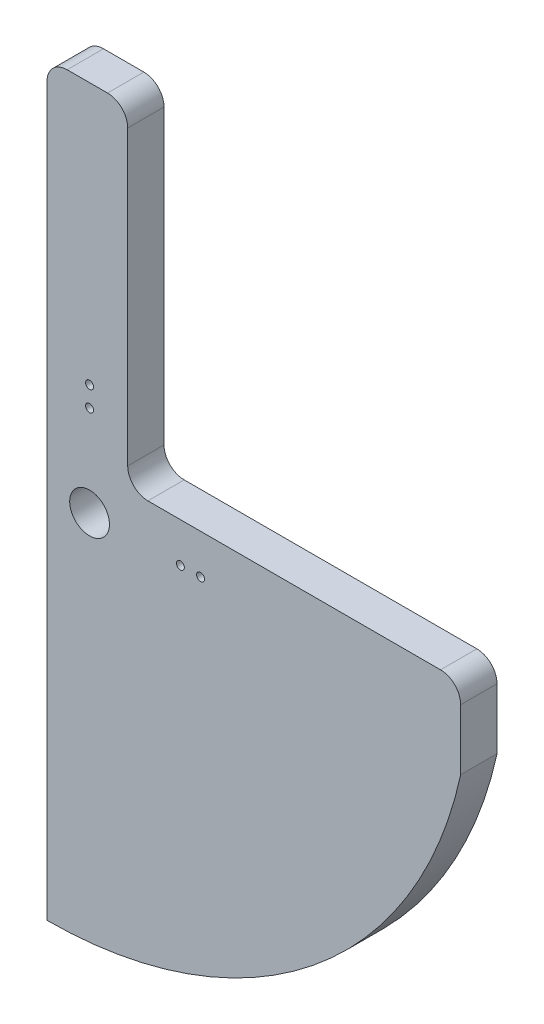
ISO-10303-21;
HEADER;
FILE_DESCRIPTION(('STEP AP214'),'2;1');
FILE_NAME('part.step','',(''),(''),'','','');
FILE_SCHEMA(('AUTOMOTIVE_DESIGN { 1 0 10303 214 1 1 1 1 }'));
ENDSEC;
DATA;
#1=APPLICATION_CONTEXT('core data for automotive mechanical design processes');
#2=APPLICATION_PROTOCOL_DEFINITION('international standard','automotive_design',2000,#1);
#3=PRODUCT_CONTEXT('',#1,'mechanical');
#4=PRODUCT('Part','Part','',(#3));
#5=PRODUCT_RELATED_PRODUCT_CATEGORY('part','',(#4));
#6=PRODUCT_DEFINITION_FORMATION('','',#4);
#7=PRODUCT_DEFINITION_CONTEXT('part definition',#1,'design');
#8=PRODUCT_DEFINITION('design','',#6,#7);
#9=PRODUCT_DEFINITION_SHAPE('','',#8);
#10=(LENGTH_UNIT() NAMED_UNIT(*) SI_UNIT(.MILLI.,.METRE.));
#11=(NAMED_UNIT(*) PLANE_ANGLE_UNIT() SI_UNIT($,.RADIAN.));
#12=(NAMED_UNIT(*) SI_UNIT($,.STERADIAN.) SOLID_ANGLE_UNIT());
#13=UNCERTAINTY_MEASURE_WITH_UNIT(LENGTH_MEASURE(1.E-05),#10,'distance_accuracy_value','');
#14=(GEOMETRIC_REPRESENTATION_CONTEXT(3) GLOBAL_UNCERTAINTY_ASSIGNED_CONTEXT((#13)) GLOBAL_UNIT_ASSIGNED_CONTEXT((#10,
#11,#12)) REPRESENTATION_CONTEXT('',''));
#15=CARTESIAN_POINT('',(0.,0.,0.));
#16=DIRECTION('',(0.,0.,1.));
#17=DIRECTION('',(1.,0.,0.));
#18=AXIS2_PLACEMENT_3D('',#15,#16,#17);
#19=CARTESIAN_POINT('',(-5.35982545721608,6.22164166704507,4.572));
#20=DIRECTION('',(0.,0.,1.));
#21=DIRECTION('',(1.,0.,0.));
#22=AXIS2_PLACEMENT_3D('',#19,#20,#21);
#23=PLANE('',#22);
#24=CARTESIAN_POINT('',(0.,13.97,4.572));
#25=DIRECTION('',(0.,0.,1.));
#26=DIRECTION('',(1.,0.,0.));
#27=AXIS2_PLACEMENT_3D('',#24,#25,#26);
#28=CIRCLE('',#27,0.5);
#29=CARTESIAN_POINT('',(0.5,13.97,4.572));
#30=VERTEX_POINT('',#29);
#31=EDGE_CURVE('E223',#30,#30,#28,.T.);
#32=ORIENTED_EDGE('',*,*,#31,.F.);
#33=EDGE_LOOP('',(#32));
#34=FACE_BOUND('',#33,.T.);
#35=CARTESIAN_POINT('',(0.,11.43,4.572));
#36=DIRECTION('',(0.,0.,1.));
#37=DIRECTION('',(1.,0.,0.));
#38=AXIS2_PLACEMENT_3D('',#35,#36,#37);
#39=CIRCLE('',#38,0.5);
#40=CARTESIAN_POINT('',(0.5,11.43,4.572));
#41=VERTEX_POINT('',#40);
#42=EDGE_CURVE('E211',#41,#41,#39,.T.);
#43=ORIENTED_EDGE('',*,*,#42,.F.);
#44=EDGE_LOOP('',(#43));
#45=FACE_BOUND('',#44,.T.);
#46=CARTESIAN_POINT('',(-5.35982545721608,6.22164166704507,4.572));
#47=DIRECTION('',(0.,0.,1.));
#48=DIRECTION('',(1.,0.,0.));
#49=AXIS2_PLACEMENT_3D('',#46,#47,#48);
#50=CIRCLE('',#49,53.3015151515152);
#51=CARTESIAN_POINT('',(-5.35982545721608,-47.0798734844701,4.572));
#52=VERTEX_POINT('',#51);
#53=CARTESIAN_POINT('',(46.7101745427839,-5.1698734844701,4.572));
#54=VERTEX_POINT('',#53);
#55=EDGE_CURVE('E162',#52,#54,#50,.T.);
#56=ORIENTED_EDGE('',*,*,#55,.T.);
#57=DIRECTION('',(0.,1.,0.));
#58=VECTOR('',#57,1.);
#59=CARTESIAN_POINT('',(46.7101745427839,-2.62987348447008,4.572));
#60=LINE('',#59,#58);
#61=CARTESIAN_POINT('',(46.7101745427839,2.45012651552991,4.572));
#62=VERTEX_POINT('',#61);
#63=EDGE_CURVE('E96',#54,#62,#60,.T.);
#64=ORIENTED_EDGE('',*,*,#63,.T.);
#65=CARTESIAN_POINT('',(44.1701745427839,2.45012651552991,4.572));
#66=DIRECTION('',(0.,0.,1.));
#67=DIRECTION('',(-1.,0.,0.));
#68=AXIS2_PLACEMENT_3D('',#65,#66,#67);
#69=CIRCLE('',#68,2.54);
#70=CARTESIAN_POINT('',(44.1701745427839,4.99012651552991,4.572));
#71=VERTEX_POINT('',#70);
#72=EDGE_CURVE('E183',#62,#71,#69,.T.);
#73=ORIENTED_EDGE('',*,*,#72,.T.);
#74=DIRECTION('',(-1.,0.,0.));
#75=VECTOR('',#74,1.);
#76=CARTESIAN_POINT('',(7.34017454278392,4.9901265155299,4.572));
#77=LINE('',#76,#75);
#78=CARTESIAN_POINT('',(7.34017454278391,4.9901265155299,4.572));
#79=VERTEX_POINT('',#78);
#80=EDGE_CURVE('E200',#71,#79,#77,.T.);
#81=ORIENTED_EDGE('',*,*,#80,.T.);
#82=CARTESIAN_POINT('',(7.34017454278391,7.5301265155299,4.572));
#83=DIRECTION('',(0.,0.,-1.));
#84=DIRECTION('',(1.,0.,0.));
#85=AXIS2_PLACEMENT_3D('',#82,#83,#84);
#86=CIRCLE('',#85,2.54);
#87=CARTESIAN_POINT('',(4.80017454278391,7.5301265155299,4.572));
#88=VERTEX_POINT('',#87);
#89=EDGE_CURVE('E197',#79,#88,#86,.T.);
#90=ORIENTED_EDGE('',*,*,#89,.T.);
#91=DIRECTION('',(0.,1.,0.));
#92=VECTOR('',#91,1.);
#93=CARTESIAN_POINT('',(4.80017454278391,7.5301265155299,4.572));
#94=LINE('',#93,#92);
#95=CARTESIAN_POINT('',(4.80017454278391,44.3601265155299,4.572));
#96=VERTEX_POINT('',#95);
#97=EDGE_CURVE('E199',#88,#96,#94,.T.);
#98=ORIENTED_EDGE('',*,*,#97,.T.);
#99=CARTESIAN_POINT('',(2.26017454278391,44.3601265155299,4.572));
#100=DIRECTION('',(0.,0.,1.));
#101=DIRECTION('',(-1.,0.,0.));
#102=AXIS2_PLACEMENT_3D('',#99,#100,#101);
#103=CIRCLE('',#102,2.54);
#104=CARTESIAN_POINT('',(2.26017454278391,46.9001265155299,4.572));
#105=VERTEX_POINT('',#104);
#106=EDGE_CURVE('E122',#96,#105,#103,.T.);
#107=ORIENTED_EDGE('',*,*,#106,.T.);
#108=DIRECTION('',(-1.,0.,0.));
#109=VECTOR('',#108,1.);
#110=CARTESIAN_POINT('',(-2.81982545721606,46.9001265155299,4.572));
#111=LINE('',#110,#109);
#112=CARTESIAN_POINT('',(-2.81982545721607,46.9001265155299,4.572));
#113=VERTEX_POINT('',#112);
#114=EDGE_CURVE('E115',#105,#113,#111,.T.);
#115=ORIENTED_EDGE('',*,*,#114,.T.);
#116=CARTESIAN_POINT('',(-2.81982545721608,44.3601265155299,4.572));
#117=DIRECTION('',(0.,0.,1.));
#118=DIRECTION('',(-1.,0.,0.));
#119=AXIS2_PLACEMENT_3D('',#116,#117,#118);
#120=CIRCLE('',#119,2.54);
#121=CARTESIAN_POINT('',(-5.35982545721608,44.3601265155299,4.572));
#122=VERTEX_POINT('',#121);
#123=EDGE_CURVE('E119',#113,#122,#120,.T.);
#124=ORIENTED_EDGE('',*,*,#123,.T.);
#125=DIRECTION('',(0.,-1.,0.));
#126=VECTOR('',#125,1.);
#127=CARTESIAN_POINT('',(-5.35982545721608,44.3601265155299,4.572));
#128=LINE('',#127,#126);
#129=EDGE_CURVE('E49',#122,#52,#128,.T.);
#130=ORIENTED_EDGE('',*,*,#129,.T.);
#131=EDGE_LOOP('',(#56,#64,#73,#81,#90,#98,#107,#115,#124,#130));
#132=FACE_BOUND('',#131,.T.);
#133=CARTESIAN_POINT('',(0.,0.,4.572));
#134=DIRECTION('',(0.,0.,1.));
#135=DIRECTION('',(1.,0.,0.));
#136=AXIS2_PLACEMENT_3D('',#133,#134,#135);
#137=CIRCLE('',#136,2.5);
#138=CARTESIAN_POINT('',(2.5,0.,4.572));
#139=VERTEX_POINT('',#138);
#140=EDGE_CURVE('E146',#139,#139,#137,.T.);
#141=ORIENTED_EDGE('',*,*,#140,.F.);
#142=EDGE_LOOP('',(#141));
#143=FACE_BOUND('',#142,.T.);
#144=CARTESIAN_POINT('',(11.43,0.,4.572));
#145=DIRECTION('',(0.,0.,1.));
#146=DIRECTION('',(1.,0.,0.));
#147=AXIS2_PLACEMENT_3D('',#144,#145,#146);
#148=CIRCLE('',#147,0.500000000000001);
#149=CARTESIAN_POINT('',(11.93,0.,4.572));
#150=VERTEX_POINT('',#149);
#151=EDGE_CURVE('E217',#150,#150,#148,.T.);
#152=ORIENTED_EDGE('',*,*,#151,.F.);
#153=EDGE_LOOP('',(#152));
#154=FACE_BOUND('',#153,.T.);
#155=CARTESIAN_POINT('',(13.97,0.,4.572));
#156=DIRECTION('',(0.,0.,1.));
#157=DIRECTION('',(1.,0.,0.));
#158=AXIS2_PLACEMENT_3D('',#155,#156,#157);
#159=CIRCLE('',#158,0.500000000000001);
#160=CARTESIAN_POINT('',(14.47,0.,4.572));
#161=VERTEX_POINT('',#160);
#162=EDGE_CURVE('E229',#161,#161,#159,.T.);
#163=ORIENTED_EDGE('',*,*,#162,.F.);
#164=EDGE_LOOP('',(#163));
#165=FACE_BOUND('',#164,.T.);
#166=ADVANCED_FACE('F32',(#34,#45,#132,#143,#154,#165),#23,.T.);
#167=CARTESIAN_POINT('',(-5.35982545721608,6.22164166704507,0.));
#168=DIRECTION('',(0.,0.,1.));
#169=DIRECTION('',(1.,0.,0.));
#170=AXIS2_PLACEMENT_3D('',#167,#168,#169);
#171=PLANE('',#170);
#172=CARTESIAN_POINT('',(-5.35982545721608,6.22164166704507,0.));
#173=DIRECTION('',(0.,0.,1.));
#174=DIRECTION('',(1.,0.,0.));
#175=AXIS2_PLACEMENT_3D('',#172,#173,#174);
#176=CIRCLE('',#175,53.3015151515152);
#177=CARTESIAN_POINT('',(-5.35982545721608,-47.0798734844701,0.));
#178=VERTEX_POINT('',#177);
#179=CARTESIAN_POINT('',(46.7101745427839,-5.1698734844701,0.));
#180=VERTEX_POINT('',#179);
#181=EDGE_CURVE('E142',#178,#180,#176,.T.);
#182=ORIENTED_EDGE('',*,*,#181,.F.);
#183=DIRECTION('',(0.,-1.,0.));
#184=VECTOR('',#183,1.);
#185=CARTESIAN_POINT('',(-5.35982545721608,-5.1698734844701,0.));
#186=LINE('',#185,#184);
#187=CARTESIAN_POINT('',(-5.35982545721608,44.3601265155299,0.));
#188=VERTEX_POINT('',#187);
#189=EDGE_CURVE('E84',#188,#178,#186,.T.);
#190=ORIENTED_EDGE('',*,*,#189,.F.);
#191=CARTESIAN_POINT('',(-2.81982545721608,44.3601265155299,0.));
#192=DIRECTION('',(0.,0.,1.));
#193=DIRECTION('',(-1.,0.,0.));
#194=AXIS2_PLACEMENT_3D('',#191,#192,#193);
#195=CIRCLE('',#194,2.54);
#196=CARTESIAN_POINT('',(-2.81982545721607,46.9001265155299,0.));
#197=VERTEX_POINT('',#196);
#198=EDGE_CURVE('E159',#197,#188,#195,.T.);
#199=ORIENTED_EDGE('',*,*,#198,.F.);
#200=DIRECTION('',(-1.,0.,0.));
#201=VECTOR('',#200,1.);
#202=CARTESIAN_POINT('',(-2.81982545721606,46.9001265155299,0.));
#203=LINE('',#202,#201);
#204=CARTESIAN_POINT('',(2.26017454278391,46.9001265155299,0.));
#205=VERTEX_POINT('',#204);
#206=EDGE_CURVE('E131',#205,#197,#203,.T.);
#207=ORIENTED_EDGE('',*,*,#206,.F.);
#208=CARTESIAN_POINT('',(2.26017454278391,44.3601265155299,0.));
#209=DIRECTION('',(0.,0.,1.));
#210=DIRECTION('',(-1.,0.,0.));
#211=AXIS2_PLACEMENT_3D('',#208,#209,#210);
#212=CIRCLE('',#211,2.54);
#213=CARTESIAN_POINT('',(4.80017454278391,44.3601265155299,0.));
#214=VERTEX_POINT('',#213);
#215=EDGE_CURVE('E156',#214,#205,#212,.T.);
#216=ORIENTED_EDGE('',*,*,#215,.F.);
#217=DIRECTION('',(0.,1.,0.));
#218=VECTOR('',#217,1.);
#219=CARTESIAN_POINT('',(4.80017454278391,7.5301265155299,0.));
#220=LINE('',#219,#218);
#221=CARTESIAN_POINT('',(4.80017454278391,7.5301265155299,0.));
#222=VERTEX_POINT('',#221);
#223=EDGE_CURVE('E154',#222,#214,#220,.T.);
#224=ORIENTED_EDGE('',*,*,#223,.F.);
#225=CARTESIAN_POINT('',(7.34017454278391,7.5301265155299,0.));
#226=DIRECTION('',(0.,0.,-1.));
#227=DIRECTION('',(1.,0.,0.));
#228=AXIS2_PLACEMENT_3D('',#225,#226,#227);
#229=CIRCLE('',#228,2.54);
#230=CARTESIAN_POINT('',(7.34017454278391,4.9901265155299,0.));
#231=VERTEX_POINT('',#230);
#232=EDGE_CURVE('E152',#231,#222,#229,.T.);
#233=ORIENTED_EDGE('',*,*,#232,.F.);
#234=DIRECTION('',(-1.,0.,0.));
#235=VECTOR('',#234,1.);
#236=CARTESIAN_POINT('',(7.34017454278392,4.9901265155299,0.));
#237=LINE('',#236,#235);
#238=CARTESIAN_POINT('',(44.1701745427839,4.99012651552991,0.));
#239=VERTEX_POINT('',#238);
#240=EDGE_CURVE('E150',#239,#231,#237,.T.);
#241=ORIENTED_EDGE('',*,*,#240,.F.);
#242=CARTESIAN_POINT('',(44.1701745427839,2.45012651552991,0.));
#243=DIRECTION('',(0.,0.,1.));
#244=DIRECTION('',(-1.,0.,0.));
#245=AXIS2_PLACEMENT_3D('',#242,#243,#244);
#246=CIRCLE('',#245,2.54);
#247=CARTESIAN_POINT('',(46.7101745427839,2.45012651552991,0.));
#248=VERTEX_POINT('',#247);
#249=EDGE_CURVE('E148',#248,#239,#246,.T.);
#250=ORIENTED_EDGE('',*,*,#249,.F.);
#251=DIRECTION('',(0.,1.,0.));
#252=VECTOR('',#251,1.);
#253=CARTESIAN_POINT('',(46.7101745427839,-2.62987348447008,0.));
#254=LINE('',#253,#252);
#255=EDGE_CURVE('E145',#180,#248,#254,.T.);
#256=ORIENTED_EDGE('',*,*,#255,.F.);
#257=EDGE_LOOP('',(#182,#190,#199,#207,#216,#224,#233,#241,#250,#256));
#258=FACE_BOUND('',#257,.T.);
#259=CARTESIAN_POINT('',(0.,0.,0.));
#260=DIRECTION('',(0.,0.,1.));
#261=DIRECTION('',(1.,0.,0.));
#262=AXIS2_PLACEMENT_3D('',#259,#260,#261);
#263=CIRCLE('',#262,2.5);
#264=CARTESIAN_POINT('',(2.5,0.,0.));
#265=VERTEX_POINT('',#264);
#266=EDGE_CURVE('E208',#265,#265,#263,.T.);
#267=ORIENTED_EDGE('',*,*,#266,.T.);
#268=EDGE_LOOP('',(#267));
#269=FACE_BOUND('',#268,.T.);
#270=CARTESIAN_POINT('',(0.,11.43,0.));
#271=DIRECTION('',(0.,0.,1.));
#272=DIRECTION('',(1.,0.,0.));
#273=AXIS2_PLACEMENT_3D('',#270,#271,#272);
#274=CIRCLE('',#273,0.5);
#275=CARTESIAN_POINT('',(0.5,11.43,0.));
#276=VERTEX_POINT('',#275);
#277=EDGE_CURVE('E214',#276,#276,#274,.T.);
#278=ORIENTED_EDGE('',*,*,#277,.T.);
#279=EDGE_LOOP('',(#278));
#280=FACE_BOUND('',#279,.T.);
#281=CARTESIAN_POINT('',(11.43,0.,0.));
#282=DIRECTION('',(0.,0.,1.));
#283=DIRECTION('',(1.,0.,0.));
#284=AXIS2_PLACEMENT_3D('',#281,#282,#283);
#285=CIRCLE('',#284,0.500000000000001);
#286=CARTESIAN_POINT('',(11.93,0.,0.));
#287=VERTEX_POINT('',#286);
#288=EDGE_CURVE('E220',#287,#287,#285,.T.);
#289=ORIENTED_EDGE('',*,*,#288,.T.);
#290=EDGE_LOOP('',(#289));
#291=FACE_BOUND('',#290,.T.);
#292=CARTESIAN_POINT('',(0.,13.97,0.));
#293=DIRECTION('',(0.,0.,1.));
#294=DIRECTION('',(1.,0.,0.));
#295=AXIS2_PLACEMENT_3D('',#292,#293,#294);
#296=CIRCLE('',#295,0.5);
#297=CARTESIAN_POINT('',(0.5,13.97,0.));
#298=VERTEX_POINT('',#297);
#299=EDGE_CURVE('E226',#298,#298,#296,.T.);
#300=ORIENTED_EDGE('',*,*,#299,.T.);
#301=EDGE_LOOP('',(#300));
#302=FACE_BOUND('',#301,.T.);
#303=CARTESIAN_POINT('',(13.97,0.,0.));
#304=DIRECTION('',(0.,0.,1.));
#305=DIRECTION('',(1.,0.,0.));
#306=AXIS2_PLACEMENT_3D('',#303,#304,#305);
#307=CIRCLE('',#306,0.500000000000001);
#308=CARTESIAN_POINT('',(14.47,0.,0.));
#309=VERTEX_POINT('',#308);
#310=EDGE_CURVE('E232',#309,#309,#307,.T.);
#311=ORIENTED_EDGE('',*,*,#310,.T.);
#312=EDGE_LOOP('',(#311));
#313=FACE_BOUND('',#312,.T.);
#314=ADVANCED_FACE('F185',(#258,#269,#280,#291,#302,#313),#171,.F.);
#315=CARTESIAN_POINT('',(-5.35982545721608,6.22164166704507,4.572));
#316=DIRECTION('',(0.,0.,-1.));
#317=DIRECTION('',(-1.,0.,0.));
#318=AXIS2_PLACEMENT_3D('',#315,#316,#317);
#319=CYLINDRICAL_SURFACE('',#318,53.3015151515152);
#320=ORIENTED_EDGE('',*,*,#181,.T.);
#321=DIRECTION('',(0.,0.,-1.));
#322=VECTOR('',#321,1.);
#323=CARTESIAN_POINT('',(46.7101745427839,-5.1698734844701,4.572));
#324=LINE('',#323,#322);
#325=EDGE_CURVE('E11',#54,#180,#324,.T.);
#326=ORIENTED_EDGE('',*,*,#325,.F.);
#327=ORIENTED_EDGE('',*,*,#55,.F.);
#328=DIRECTION('',(0.,0.,-1.));
#329=VECTOR('',#328,1.);
#330=CARTESIAN_POINT('',(-5.35982545721608,-47.0798734844701,4.572));
#331=LINE('',#330,#329);
#332=EDGE_CURVE('E138',#52,#178,#331,.T.);
#333=ORIENTED_EDGE('',*,*,#332,.T.);
#334=EDGE_LOOP('',(#320,#326,#327,#333));
#335=FACE_BOUND('',#334,.T.);
#336=ADVANCED_FACE('F34',(#335),#319,.T.);
#337=CARTESIAN_POINT('',(46.7101745427839,-2.62987348447008,4.572));
#338=DIRECTION('',(-1.,0.,0.));
#339=DIRECTION('',(0.,0.,1.));
#340=AXIS2_PLACEMENT_3D('',#337,#338,#339);
#341=PLANE('',#340);
#342=ORIENTED_EDGE('',*,*,#255,.T.);
#343=DIRECTION('',(0.,0.,-1.));
#344=VECTOR('',#343,1.);
#345=CARTESIAN_POINT('',(46.7101745427839,2.45012651552991,4.572));
#346=LINE('',#345,#344);
#347=EDGE_CURVE('E41',#62,#248,#346,.T.);
#348=ORIENTED_EDGE('',*,*,#347,.F.);
#349=ORIENTED_EDGE('',*,*,#63,.F.);
#350=ORIENTED_EDGE('',*,*,#325,.T.);
#351=EDGE_LOOP('',(#342,#348,#349,#350));
#352=FACE_BOUND('',#351,.T.);
#353=ADVANCED_FACE('F274',(#352),#341,.F.);
#354=CARTESIAN_POINT('',(44.1701745427839,2.45012651552991,4.572));
#355=DIRECTION('',(0.,0.,-1.));
#356=DIRECTION('',(-1.,0.,0.));
#357=AXIS2_PLACEMENT_3D('',#354,#355,#356);
#358=CYLINDRICAL_SURFACE('',#357,2.54);
#359=ORIENTED_EDGE('',*,*,#249,.T.);
#360=DIRECTION('',(0.,0.,-1.));
#361=VECTOR('',#360,1.);
#362=CARTESIAN_POINT('',(44.1701745427839,4.99012651552991,4.572));
#363=LINE('',#362,#361);
#364=EDGE_CURVE('E175',#71,#239,#363,.T.);
#365=ORIENTED_EDGE('',*,*,#364,.F.);
#366=ORIENTED_EDGE('',*,*,#72,.F.);
#367=ORIENTED_EDGE('',*,*,#347,.T.);
#368=EDGE_LOOP('',(#359,#365,#366,#367));
#369=FACE_BOUND('',#368,.T.);
#370=ADVANCED_FACE('F181',(#369),#358,.T.);
#371=CARTESIAN_POINT('',(7.34017454278392,4.9901265155299,4.572));
#372=DIRECTION('',(0.,-1.,0.));
#373=DIRECTION('',(1.,0.,0.));
#374=AXIS2_PLACEMENT_3D('',#371,#372,#373);
#375=PLANE('',#374);
#376=ORIENTED_EDGE('',*,*,#240,.T.);
#377=DIRECTION('',(0.,0.,-1.));
#378=VECTOR('',#377,1.);
#379=CARTESIAN_POINT('',(7.34017454278391,4.9901265155299,4.572));
#380=LINE('',#379,#378);
#381=EDGE_CURVE('E172',#79,#231,#380,.T.);
#382=ORIENTED_EDGE('',*,*,#381,.F.);
#383=ORIENTED_EDGE('',*,*,#80,.F.);
#384=ORIENTED_EDGE('',*,*,#364,.T.);
#385=EDGE_LOOP('',(#376,#382,#383,#384));
#386=FACE_BOUND('',#385,.T.);
#387=ADVANCED_FACE('F191',(#386),#375,.F.);
#388=CARTESIAN_POINT('',(7.34017454278391,7.5301265155299,4.572));
#389=DIRECTION('',(0.,0.,-1.));
#390=DIRECTION('',(-1.,0.,0.));
#391=AXIS2_PLACEMENT_3D('',#388,#389,#390);
#392=CYLINDRICAL_SURFACE('',#391,2.54);
#393=ORIENTED_EDGE('',*,*,#232,.T.);
#394=DIRECTION('',(0.,0.,-1.));
#395=VECTOR('',#394,1.);
#396=CARTESIAN_POINT('',(4.80017454278391,7.5301265155299,4.572));
#397=LINE('',#396,#395);
#398=EDGE_CURVE('E169',#88,#222,#397,.T.);
#399=ORIENTED_EDGE('',*,*,#398,.F.);
#400=ORIENTED_EDGE('',*,*,#89,.F.);
#401=ORIENTED_EDGE('',*,*,#381,.T.);
#402=EDGE_LOOP('',(#393,#399,#400,#401));
#403=FACE_BOUND('',#402,.T.);
#404=ADVANCED_FACE('F195',(#403),#392,.F.);
#405=CARTESIAN_POINT('',(4.80017454278391,7.5301265155299,4.572));
#406=DIRECTION('',(-1.,0.,0.));
#407=DIRECTION('',(0.,-1.,0.));
#408=AXIS2_PLACEMENT_3D('',#405,#406,#407);
#409=PLANE('',#408);
#410=ORIENTED_EDGE('',*,*,#223,.T.);
#411=DIRECTION('',(0.,0.,-1.));
#412=VECTOR('',#411,1.);
#413=CARTESIAN_POINT('',(4.80017454278391,44.3601265155299,4.572));
#414=LINE('',#413,#412);
#415=EDGE_CURVE('E166',#96,#214,#414,.T.);
#416=ORIENTED_EDGE('',*,*,#415,.F.);
#417=ORIENTED_EDGE('',*,*,#97,.F.);
#418=ORIENTED_EDGE('',*,*,#398,.T.);
#419=EDGE_LOOP('',(#410,#416,#417,#418));
#420=FACE_BOUND('',#419,.T.);
#421=ADVANCED_FACE('F264',(#420),#409,.F.);
#422=CARTESIAN_POINT('',(2.26017454278391,44.3601265155299,4.572));
#423=DIRECTION('',(0.,0.,-1.));
#424=DIRECTION('',(-1.,0.,0.));
#425=AXIS2_PLACEMENT_3D('',#422,#423,#424);
#426=CYLINDRICAL_SURFACE('',#425,2.54);
#427=ORIENTED_EDGE('',*,*,#215,.T.);
#428=DIRECTION('',(0.,0.,-1.));
#429=VECTOR('',#428,1.);
#430=CARTESIAN_POINT('',(2.26017454278391,46.9001265155299,4.572));
#431=LINE('',#430,#429);
#432=EDGE_CURVE('E133',#105,#205,#431,.T.);
#433=ORIENTED_EDGE('',*,*,#432,.F.);
#434=ORIENTED_EDGE('',*,*,#106,.F.);
#435=ORIENTED_EDGE('',*,*,#415,.T.);
#436=EDGE_LOOP('',(#427,#433,#434,#435));
#437=FACE_BOUND('',#436,.T.);
#438=ADVANCED_FACE('F261',(#437),#426,.T.);
#439=CARTESIAN_POINT('',(-2.81982545721606,46.9001265155299,4.572));
#440=DIRECTION('',(0.,-1.,0.));
#441=DIRECTION('',(0.,0.,-1.));
#442=AXIS2_PLACEMENT_3D('',#439,#440,#441);
#443=PLANE('',#442);
#444=ORIENTED_EDGE('',*,*,#206,.T.);
#445=DIRECTION('',(0.,0.,-1.));
#446=VECTOR('',#445,1.);
#447=CARTESIAN_POINT('',(-2.81982545721607,46.9001265155299,4.572));
#448=LINE('',#447,#446);
#449=EDGE_CURVE('E128',#113,#197,#448,.T.);
#450=ORIENTED_EDGE('',*,*,#449,.F.);
#451=ORIENTED_EDGE('',*,*,#114,.F.);
#452=ORIENTED_EDGE('',*,*,#432,.T.);
#453=EDGE_LOOP('',(#444,#450,#451,#452));
#454=FACE_BOUND('',#453,.T.);
#455=ADVANCED_FACE('F129',(#454),#443,.F.);
#456=CARTESIAN_POINT('',(-2.81982545721608,44.3601265155299,4.572));
#457=DIRECTION('',(0.,0.,-1.));
#458=DIRECTION('',(-1.,0.,0.));
#459=AXIS2_PLACEMENT_3D('',#456,#457,#458);
#460=CYLINDRICAL_SURFACE('',#459,2.54);
#461=ORIENTED_EDGE('',*,*,#198,.T.);
#462=DIRECTION('',(0.,0.,-1.));
#463=VECTOR('',#462,1.);
#464=CARTESIAN_POINT('',(-5.35982545721608,44.3601265155299,4.572));
#465=LINE('',#464,#463);
#466=EDGE_CURVE('E134',#122,#188,#465,.T.);
#467=ORIENTED_EDGE('',*,*,#466,.F.);
#468=ORIENTED_EDGE('',*,*,#123,.F.);
#469=ORIENTED_EDGE('',*,*,#449,.T.);
#470=EDGE_LOOP('',(#461,#467,#468,#469));
#471=FACE_BOUND('',#470,.T.);
#472=ADVANCED_FACE('F136',(#471),#460,.T.);
#473=CARTESIAN_POINT('',(-5.35982545721608,-5.1698734844701,4.572));
#474=DIRECTION('',(1.,0.,0.));
#475=DIRECTION('',(0.,0.,-1.));
#476=AXIS2_PLACEMENT_3D('',#473,#474,#475);
#477=PLANE('',#476);
#478=ORIENTED_EDGE('',*,*,#189,.T.);
#479=ORIENTED_EDGE('',*,*,#332,.F.);
#480=ORIENTED_EDGE('',*,*,#129,.F.);
#481=ORIENTED_EDGE('',*,*,#466,.T.);
#482=EDGE_LOOP('',(#478,#479,#480,#481));
#483=FACE_BOUND('',#482,.T.);
#484=ADVANCED_FACE('F254',(#483),#477,.F.);
#485=CARTESIAN_POINT('',(0.,0.,4.572));
#486=DIRECTION('',(0.,0.,-1.));
#487=DIRECTION('',(-1.,0.,0.));
#488=AXIS2_PLACEMENT_3D('',#485,#486,#487);
#489=CYLINDRICAL_SURFACE('',#488,2.5);
#490=ORIENTED_EDGE('',*,*,#140,.T.);
#491=EDGE_LOOP('',(#490));
#492=FACE_BOUND('',#491,.T.);
#493=ORIENTED_EDGE('',*,*,#266,.F.);
#494=EDGE_LOOP('',(#493));
#495=FACE_BOUND('',#494,.T.);
#496=ADVANCED_FACE('F251',(#492,#495),#489,.F.);
#497=CARTESIAN_POINT('',(0.,11.43,4.572));
#498=DIRECTION('',(0.,0.,-1.));
#499=DIRECTION('',(-1.,0.,0.));
#500=AXIS2_PLACEMENT_3D('',#497,#498,#499);
#501=CYLINDRICAL_SURFACE('',#500,0.5);
#502=ORIENTED_EDGE('',*,*,#42,.T.);
#503=EDGE_LOOP('',(#502));
#504=FACE_BOUND('',#503,.T.);
#505=ORIENTED_EDGE('',*,*,#277,.F.);
#506=EDGE_LOOP('',(#505));
#507=FACE_BOUND('',#506,.T.);
#508=ADVANCED_FACE('F354',(#504,#507),#501,.F.);
#509=CARTESIAN_POINT('',(11.43,0.,4.572));
#510=DIRECTION('',(0.,0.,-1.));
#511=DIRECTION('',(-1.,0.,0.));
#512=AXIS2_PLACEMENT_3D('',#509,#510,#511);
#513=CYLINDRICAL_SURFACE('',#512,0.500000000000001);
#514=ORIENTED_EDGE('',*,*,#151,.T.);
#515=EDGE_LOOP('',(#514));
#516=FACE_BOUND('',#515,.T.);
#517=ORIENTED_EDGE('',*,*,#288,.F.);
#518=EDGE_LOOP('',(#517));
#519=FACE_BOUND('',#518,.T.);
#520=ADVANCED_FACE('F362',(#516,#519),#513,.F.);
#521=CARTESIAN_POINT('',(0.,13.97,4.572));
#522=DIRECTION('',(0.,0.,-1.));
#523=DIRECTION('',(-1.,0.,0.));
#524=AXIS2_PLACEMENT_3D('',#521,#522,#523);
#525=CYLINDRICAL_SURFACE('',#524,0.5);
#526=ORIENTED_EDGE('',*,*,#31,.T.);
#527=EDGE_LOOP('',(#526));
#528=FACE_BOUND('',#527,.T.);
#529=ORIENTED_EDGE('',*,*,#299,.F.);
#530=EDGE_LOOP('',(#529));
#531=FACE_BOUND('',#530,.T.);
#532=ADVANCED_FACE('F370',(#528,#531),#525,.F.);
#533=CARTESIAN_POINT('',(13.97,0.,4.572));
#534=DIRECTION('',(0.,0.,-1.));
#535=DIRECTION('',(-1.,0.,0.));
#536=AXIS2_PLACEMENT_3D('',#533,#534,#535);
#537=CYLINDRICAL_SURFACE('',#536,0.500000000000001);
#538=ORIENTED_EDGE('',*,*,#162,.T.);
#539=EDGE_LOOP('',(#538));
#540=FACE_BOUND('',#539,.T.);
#541=ORIENTED_EDGE('',*,*,#310,.F.);
#542=EDGE_LOOP('',(#541));
#543=FACE_BOUND('',#542,.T.);
#544=ADVANCED_FACE('F238',(#540,#543),#537,.F.);
#545=CLOSED_SHELL('',(#166,#314,#336,#353,#370,#387,#404,#421,#438,#455,#472,#484,#496,#508,
#520,#532,#544));
#546=MANIFOLD_SOLID_BREP('B2',#545);
#547=ADVANCED_BREP_SHAPE_REPRESENTATION('',(#18,#546),#14);
#548=SHAPE_DEFINITION_REPRESENTATION(#9,#547);
ENDSEC;
END-ISO-10303-21;
